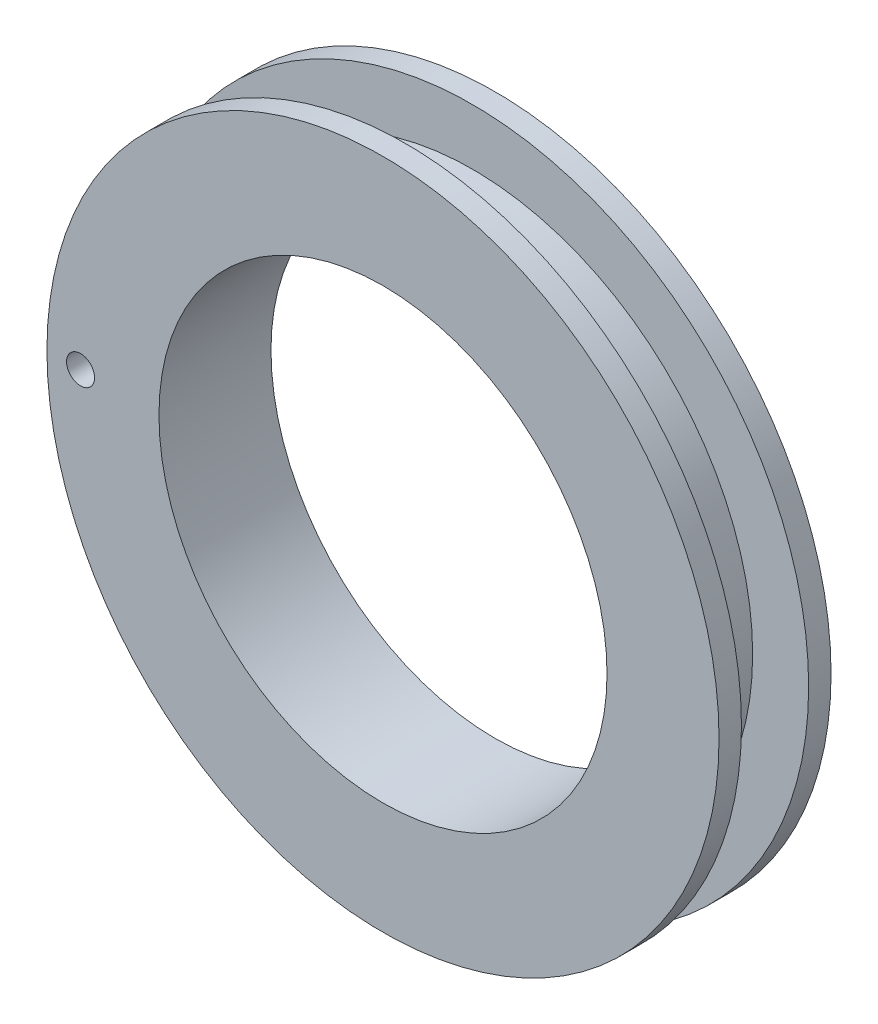
ISO-10303-21;
HEADER;
FILE_DESCRIPTION(('STEP AP214'),'2;1');
FILE_NAME('part.step','',(''),(''),'','','');
FILE_SCHEMA(('AUTOMOTIVE_DESIGN { 1 0 10303 214 1 1 1 1 }'));
ENDSEC;
DATA;
#1=APPLICATION_CONTEXT('core data for automotive mechanical design processes');
#2=APPLICATION_PROTOCOL_DEFINITION('international standard','automotive_design',2000,#1);
#3=PRODUCT_CONTEXT('',#1,'mechanical');
#4=PRODUCT('Part','Part','',(#3));
#5=PRODUCT_RELATED_PRODUCT_CATEGORY('part','',(#4));
#6=PRODUCT_DEFINITION_FORMATION('','',#4);
#7=PRODUCT_DEFINITION_CONTEXT('part definition',#1,'design');
#8=PRODUCT_DEFINITION('design','',#6,#7);
#9=PRODUCT_DEFINITION_SHAPE('','',#8);
#10=(LENGTH_UNIT() NAMED_UNIT(*) SI_UNIT(.MILLI.,.METRE.));
#11=(NAMED_UNIT(*) PLANE_ANGLE_UNIT() SI_UNIT($,.RADIAN.));
#12=(NAMED_UNIT(*) SI_UNIT($,.STERADIAN.) SOLID_ANGLE_UNIT());
#13=UNCERTAINTY_MEASURE_WITH_UNIT(LENGTH_MEASURE(1.E-05),#10,'distance_accuracy_value','');
#14=(GEOMETRIC_REPRESENTATION_CONTEXT(3) GLOBAL_UNCERTAINTY_ASSIGNED_CONTEXT((#13)) GLOBAL_UNIT_ASSIGNED_CONTEXT((#10,
#11,#12)) REPRESENTATION_CONTEXT('',''));
#15=CARTESIAN_POINT('',(0.,0.,0.));
#16=DIRECTION('',(0.,0.,1.));
#17=DIRECTION('',(1.,0.,0.));
#18=AXIS2_PLACEMENT_3D('',#15,#16,#17);
#19=CARTESIAN_POINT('',(0.,0.,6.));
#20=DIRECTION('',(0.,0.,-1.));
#21=DIRECTION('',(-1.,0.,0.));
#22=AXIS2_PLACEMENT_3D('',#19,#20,#21);
#23=CYLINDRICAL_SURFACE('',#22,25.);
#24=CARTESIAN_POINT('',(0.,0.,6.));
#25=DIRECTION('',(0.,0.,1.));
#26=DIRECTION('',(1.,0.,0.));
#27=AXIS2_PLACEMENT_3D('',#24,#25,#26);
#28=CIRCLE('',#27,25.);
#29=CARTESIAN_POINT('',(25.,0.,6.));
#30=VERTEX_POINT('',#29);
#31=EDGE_CURVE('E10',#30,#30,#28,.T.);
#32=ORIENTED_EDGE('',*,*,#31,.F.);
#33=EDGE_LOOP('',(#32));
#34=FACE_BOUND('',#33,.T.);
#35=CARTESIAN_POINT('',(0.,0.,0.));
#36=DIRECTION('',(0.,0.,1.));
#37=DIRECTION('',(1.,0.,0.));
#38=AXIS2_PLACEMENT_3D('',#35,#36,#37);
#39=CIRCLE('',#38,25.);
#40=CARTESIAN_POINT('',(25.,0.,0.));
#41=VERTEX_POINT('',#40);
#42=EDGE_CURVE('E58',#41,#41,#39,.T.);
#43=ORIENTED_EDGE('',*,*,#42,.T.);
#44=EDGE_LOOP('',(#43));
#45=FACE_BOUND('',#44,.T.);
#46=ADVANCED_FACE('F41',(#34,#45),#23,.T.);
#47=CARTESIAN_POINT('',(0.,0.,8.));
#48=DIRECTION('',(0.,0.,-1.));
#49=DIRECTION('',(-1.,0.,0.));
#50=AXIS2_PLACEMENT_3D('',#47,#48,#49);
#51=CYLINDRICAL_SURFACE('',#50,30.);
#52=CARTESIAN_POINT('',(0.,0.,8.));
#53=DIRECTION('',(0.,0.,1.));
#54=DIRECTION('',(1.,0.,0.));
#55=AXIS2_PLACEMENT_3D('',#52,#53,#54);
#56=CIRCLE('',#55,30.);
#57=CARTESIAN_POINT('',(30.,0.,8.));
#58=VERTEX_POINT('',#57);
#59=EDGE_CURVE('E49',#58,#58,#56,.T.);
#60=ORIENTED_EDGE('',*,*,#59,.F.);
#61=EDGE_LOOP('',(#60));
#62=FACE_BOUND('',#61,.T.);
#63=CARTESIAN_POINT('',(0.,0.,6.));
#64=DIRECTION('',(0.,0.,1.));
#65=DIRECTION('',(1.,0.,0.));
#66=AXIS2_PLACEMENT_3D('',#63,#64,#65);
#67=CIRCLE('',#66,30.);
#68=CARTESIAN_POINT('',(30.,0.,6.));
#69=VERTEX_POINT('',#68);
#70=EDGE_CURVE('E55',#69,#69,#67,.T.);
#71=ORIENTED_EDGE('',*,*,#70,.T.);
#72=EDGE_LOOP('',(#71));
#73=FACE_BOUND('',#72,.T.);
#74=ADVANCED_FACE('F118',(#62,#73),#51,.T.);
#75=CARTESIAN_POINT('',(0.,0.,8.));
#76=DIRECTION('',(0.,0.,1.));
#77=DIRECTION('',(1.,0.,0.));
#78=AXIS2_PLACEMENT_3D('',#75,#76,#77);
#79=PLANE('',#78);
#80=CARTESIAN_POINT('',(-27.,0.,8.));
#81=DIRECTION('',(0.,0.,1.));
#82=DIRECTION('',(1.,0.,0.));
#83=AXIS2_PLACEMENT_3D('',#80,#81,#82);
#84=CIRCLE('',#83,1.25);
#85=CARTESIAN_POINT('',(-25.75,0.,8.));
#86=VERTEX_POINT('',#85);
#87=EDGE_CURVE('E88',#86,#86,#84,.T.);
#88=ORIENTED_EDGE('',*,*,#87,.F.);
#89=EDGE_LOOP('',(#88));
#90=FACE_BOUND('',#89,.T.);
#91=CARTESIAN_POINT('',(0.,0.,8.));
#92=DIRECTION('',(0.,0.,-1.));
#93=DIRECTION('',(-1.,0.,0.));
#94=AXIS2_PLACEMENT_3D('',#91,#92,#93);
#95=CIRCLE('',#94,20.);
#96=CARTESIAN_POINT('',(-20.,0.,8.));
#97=VERTEX_POINT('',#96);
#98=EDGE_CURVE('E74',#97,#97,#95,.T.);
#99=ORIENTED_EDGE('',*,*,#98,.T.);
#100=EDGE_LOOP('',(#99));
#101=FACE_BOUND('',#100,.T.);
#102=ORIENTED_EDGE('',*,*,#59,.T.);
#103=EDGE_LOOP('',(#102));
#104=FACE_BOUND('',#103,.T.);
#105=ADVANCED_FACE('F123',(#90,#101,#104),#79,.T.);
#106=CARTESIAN_POINT('',(0.,0.,6.));
#107=DIRECTION('',(0.,0.,1.));
#108=DIRECTION('',(1.,0.,0.));
#109=AXIS2_PLACEMENT_3D('',#106,#107,#108);
#110=PLANE('',#109);
#111=CARTESIAN_POINT('',(-27.,0.,6.));
#112=DIRECTION('',(0.,0.,1.));
#113=DIRECTION('',(1.,0.,0.));
#114=AXIS2_PLACEMENT_3D('',#111,#112,#113);
#115=CIRCLE('',#114,1.25);
#116=CARTESIAN_POINT('',(-25.75,0.,6.));
#117=VERTEX_POINT('',#116);
#118=EDGE_CURVE('E81',#117,#117,#115,.T.);
#119=ORIENTED_EDGE('',*,*,#118,.T.);
#120=EDGE_LOOP('',(#119));
#121=FACE_BOUND('',#120,.T.);
#122=ORIENTED_EDGE('',*,*,#31,.T.);
#123=EDGE_LOOP('',(#122));
#124=FACE_BOUND('',#123,.T.);
#125=ORIENTED_EDGE('',*,*,#70,.F.);
#126=EDGE_LOOP('',(#125));
#127=FACE_BOUND('',#126,.T.);
#128=ADVANCED_FACE('F128',(#121,#124,#127),#110,.F.);
#129=CARTESIAN_POINT('',(0.,0.,-2.));
#130=DIRECTION('',(0.,0.,1.));
#131=DIRECTION('',(1.,0.,0.));
#132=AXIS2_PLACEMENT_3D('',#129,#130,#131);
#133=CYLINDRICAL_SURFACE('',#132,30.);
#134=CARTESIAN_POINT('',(0.,0.,-2.));
#135=DIRECTION('',(0.,0.,-1.));
#136=DIRECTION('',(-1.,0.,0.));
#137=AXIS2_PLACEMENT_3D('',#134,#135,#136);
#138=CIRCLE('',#137,30.);
#139=CARTESIAN_POINT('',(-30.,0.,-2.));
#140=VERTEX_POINT('',#139);
#141=EDGE_CURVE('E61',#140,#140,#138,.T.);
#142=ORIENTED_EDGE('',*,*,#141,.F.);
#143=EDGE_LOOP('',(#142));
#144=FACE_BOUND('',#143,.T.);
#145=CARTESIAN_POINT('',(0.,0.,0.));
#146=DIRECTION('',(0.,0.,-1.));
#147=DIRECTION('',(-1.,0.,0.));
#148=AXIS2_PLACEMENT_3D('',#145,#146,#147);
#149=CIRCLE('',#148,30.);
#150=CARTESIAN_POINT('',(-30.,0.,0.));
#151=VERTEX_POINT('',#150);
#152=EDGE_CURVE('E68',#151,#151,#149,.T.);
#153=ORIENTED_EDGE('',*,*,#152,.T.);
#154=EDGE_LOOP('',(#153));
#155=FACE_BOUND('',#154,.T.);
#156=ADVANCED_FACE('F135',(#144,#155),#133,.T.);
#157=CARTESIAN_POINT('',(0.,0.,-2.));
#158=DIRECTION('',(0.,0.,-1.));
#159=DIRECTION('',(-1.,0.,0.));
#160=AXIS2_PLACEMENT_3D('',#157,#158,#159);
#161=PLANE('',#160);
#162=CARTESIAN_POINT('',(-27.,0.,-2.));
#163=DIRECTION('',(0.,0.,1.));
#164=DIRECTION('',(1.,0.,0.));
#165=AXIS2_PLACEMENT_3D('',#162,#163,#164);
#166=CIRCLE('',#165,1.25);
#167=CARTESIAN_POINT('',(-25.75,0.,-2.));
#168=VERTEX_POINT('',#167);
#169=EDGE_CURVE('E92',#168,#168,#166,.T.);
#170=ORIENTED_EDGE('',*,*,#169,.T.);
#171=EDGE_LOOP('',(#170));
#172=FACE_BOUND('',#171,.T.);
#173=CARTESIAN_POINT('',(0.,0.,-2.));
#174=DIRECTION('',(0.,0.,-1.));
#175=DIRECTION('',(-1.,0.,0.));
#176=AXIS2_PLACEMENT_3D('',#173,#174,#175);
#177=CIRCLE('',#176,20.);
#178=CARTESIAN_POINT('',(-20.,0.,-2.));
#179=VERTEX_POINT('',#178);
#180=EDGE_CURVE('E77',#179,#179,#177,.T.);
#181=ORIENTED_EDGE('',*,*,#180,.F.);
#182=EDGE_LOOP('',(#181));
#183=FACE_BOUND('',#182,.T.);
#184=ORIENTED_EDGE('',*,*,#141,.T.);
#185=EDGE_LOOP('',(#184));
#186=FACE_BOUND('',#185,.T.);
#187=ADVANCED_FACE('F140',(#172,#183,#186),#161,.T.);
#188=CARTESIAN_POINT('',(0.,0.,0.));
#189=DIRECTION('',(0.,0.,-1.));
#190=DIRECTION('',(-1.,0.,0.));
#191=AXIS2_PLACEMENT_3D('',#188,#189,#190);
#192=PLANE('',#191);
#193=CARTESIAN_POINT('',(-27.,0.,0.));
#194=DIRECTION('',(0.,0.,-1.));
#195=DIRECTION('',(-1.,0.,0.));
#196=AXIS2_PLACEMENT_3D('',#193,#194,#195);
#197=CIRCLE('',#196,1.25);
#198=CARTESIAN_POINT('',(-28.25,0.,0.));
#199=VERTEX_POINT('',#198);
#200=EDGE_CURVE('E44',#199,#199,#197,.T.);
#201=ORIENTED_EDGE('',*,*,#200,.T.);
#202=EDGE_LOOP('',(#201));
#203=FACE_BOUND('',#202,.T.);
#204=ORIENTED_EDGE('',*,*,#42,.F.);
#205=EDGE_LOOP('',(#204));
#206=FACE_BOUND('',#205,.T.);
#207=ORIENTED_EDGE('',*,*,#152,.F.);
#208=EDGE_LOOP('',(#207));
#209=FACE_BOUND('',#208,.T.);
#210=ADVANCED_FACE('F101',(#203,#206,#209),#192,.F.);
#211=CARTESIAN_POINT('',(0.,0.,8.));
#212=DIRECTION('',(0.,0.,-1.));
#213=DIRECTION('',(-1.,0.,0.));
#214=AXIS2_PLACEMENT_3D('',#211,#212,#213);
#215=CYLINDRICAL_SURFACE('',#214,20.);
#216=ORIENTED_EDGE('',*,*,#98,.F.);
#217=EDGE_LOOP('',(#216));
#218=FACE_BOUND('',#217,.T.);
#219=ORIENTED_EDGE('',*,*,#180,.T.);
#220=EDGE_LOOP('',(#219));
#221=FACE_BOUND('',#220,.T.);
#222=ADVANCED_FACE('F107',(#218,#221),#215,.F.);
#223=CARTESIAN_POINT('',(-27.,0.,-2.));
#224=DIRECTION('',(0.,0.,1.));
#225=DIRECTION('',(1.,0.,0.));
#226=AXIS2_PLACEMENT_3D('',#223,#224,#225);
#227=CYLINDRICAL_SURFACE('',#226,1.25);
#228=ORIENTED_EDGE('',*,*,#169,.F.);
#229=EDGE_LOOP('',(#228));
#230=FACE_BOUND('',#229,.T.);
#231=ORIENTED_EDGE('',*,*,#200,.F.);
#232=EDGE_LOOP('',(#231));
#233=FACE_BOUND('',#232,.T.);
#234=ADVANCED_FACE('F104',(#230,#233),#227,.F.);
#235=ORIENTED_EDGE('',*,*,#87,.T.);
#236=EDGE_LOOP('',(#235));
#237=FACE_BOUND('',#236,.T.);
#238=ORIENTED_EDGE('',*,*,#118,.F.);
#239=EDGE_LOOP('',(#238));
#240=FACE_BOUND('',#239,.T.);
#241=ADVANCED_FACE('F106',(#237,#240),#227,.F.);
#242=CLOSED_SHELL('',(#46,#74,#105,#128,#156,#187,#210,#222,#234,#241));
#243=MANIFOLD_SOLID_BREP('B2',#242);
#244=ADVANCED_BREP_SHAPE_REPRESENTATION('',(#18,#243),#14);
#245=SHAPE_DEFINITION_REPRESENTATION(#9,#244);
ENDSEC;
END-ISO-10303-21;
